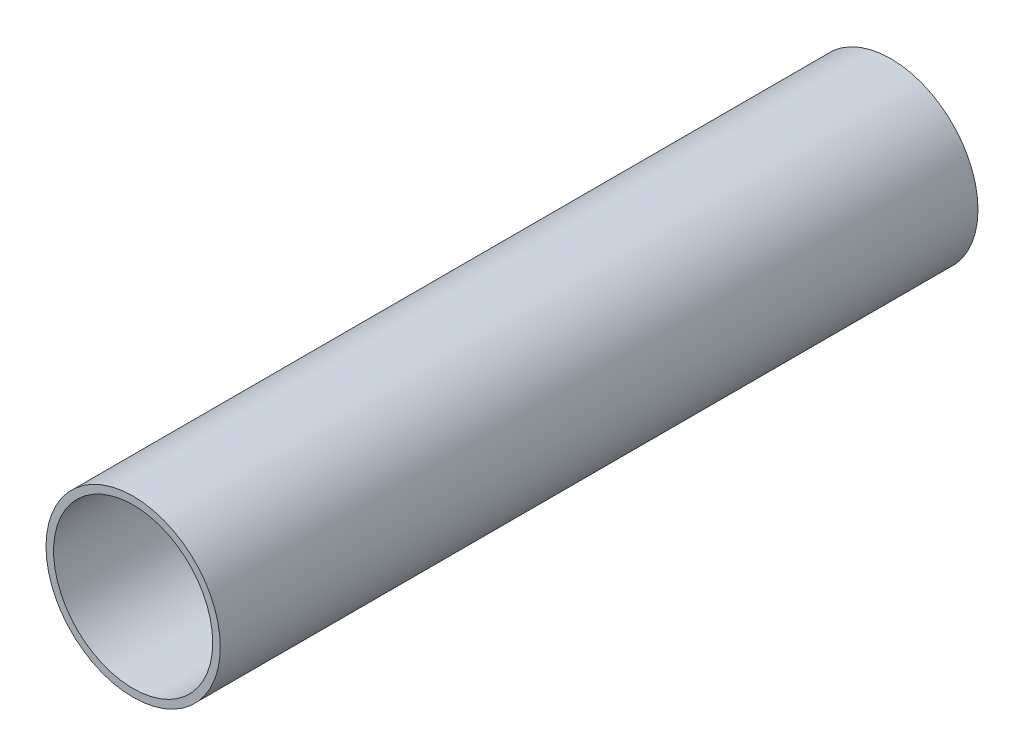
ISO-10303-21;
HEADER;
FILE_DESCRIPTION(('STEP AP214'),'2;1');
FILE_NAME('part.step','',(''),(''),'','','');
FILE_SCHEMA(('AUTOMOTIVE_DESIGN { 1 0 10303 214 1 1 1 1 }'));
ENDSEC;
DATA;
#1=APPLICATION_CONTEXT('core data for automotive mechanical design processes');
#2=APPLICATION_PROTOCOL_DEFINITION('international standard','automotive_design',2000,#1);
#3=PRODUCT_CONTEXT('',#1,'mechanical');
#4=PRODUCT('Part','Part','',(#3));
#5=PRODUCT_RELATED_PRODUCT_CATEGORY('part','',(#4));
#6=PRODUCT_DEFINITION_FORMATION('','',#4);
#7=PRODUCT_DEFINITION_CONTEXT('part definition',#1,'design');
#8=PRODUCT_DEFINITION('design','',#6,#7);
#9=PRODUCT_DEFINITION_SHAPE('','',#8);
#10=(LENGTH_UNIT() NAMED_UNIT(*) SI_UNIT(.MILLI.,.METRE.));
#11=(NAMED_UNIT(*) PLANE_ANGLE_UNIT() SI_UNIT($,.RADIAN.));
#12=(NAMED_UNIT(*) SI_UNIT($,.STERADIAN.) SOLID_ANGLE_UNIT());
#13=UNCERTAINTY_MEASURE_WITH_UNIT(LENGTH_MEASURE(1.E-05),#10,'distance_accuracy_value','');
#14=(GEOMETRIC_REPRESENTATION_CONTEXT(3) GLOBAL_UNCERTAINTY_ASSIGNED_CONTEXT((#13)) GLOBAL_UNIT_ASSIGNED_CONTEXT((#10,
#11,#12)) REPRESENTATION_CONTEXT('',''));
#15=CARTESIAN_POINT('',(0.,0.,0.));
#16=DIRECTION('',(0.,0.,1.));
#17=DIRECTION('',(1.,0.,0.));
#18=AXIS2_PLACEMENT_3D('',#15,#16,#17);
#19=CARTESIAN_POINT('',(0.,0.,100.));
#20=DIRECTION('',(0.,0.,1.));
#21=DIRECTION('',(1.,0.,0.));
#22=AXIS2_PLACEMENT_3D('',#19,#20,#21);
#23=PLANE('',#22);
#24=CARTESIAN_POINT('',(0.,0.,100.));
#25=DIRECTION('',(0.,0.,1.));
#26=DIRECTION('',(1.,0.,0.));
#27=AXIS2_PLACEMENT_3D('',#24,#25,#26);
#28=CIRCLE('',#27,11.5);
#29=CARTESIAN_POINT('',(11.5,0.,100.));
#30=VERTEX_POINT('',#29);
#31=EDGE_CURVE('E10',#30,#30,#28,.T.);
#32=ORIENTED_EDGE('',*,*,#31,.T.);
#33=EDGE_LOOP('',(#32));
#34=FACE_BOUND('',#33,.T.);
#35=CARTESIAN_POINT('',(0.,0.,100.));
#36=DIRECTION('',(0.,0.,1.));
#37=DIRECTION('',(1.,0.,0.));
#38=AXIS2_PLACEMENT_3D('',#35,#36,#37);
#39=CIRCLE('',#38,10.5);
#40=CARTESIAN_POINT('',(10.5,0.,100.));
#41=VERTEX_POINT('',#40);
#42=EDGE_CURVE('E42',#41,#41,#39,.T.);
#43=ORIENTED_EDGE('',*,*,#42,.F.);
#44=EDGE_LOOP('',(#43));
#45=FACE_BOUND('',#44,.T.);
#46=ADVANCED_FACE('F31',(#34,#45),#23,.T.);
#47=CARTESIAN_POINT('',(0.,0.,0.));
#48=DIRECTION('',(0.,0.,1.));
#49=DIRECTION('',(1.,0.,0.));
#50=AXIS2_PLACEMENT_3D('',#47,#48,#49);
#51=PLANE('',#50);
#52=CARTESIAN_POINT('',(0.,0.,0.));
#53=DIRECTION('',(0.,0.,1.));
#54=DIRECTION('',(1.,0.,0.));
#55=AXIS2_PLACEMENT_3D('',#52,#53,#54);
#56=CIRCLE('',#55,11.5);
#57=CARTESIAN_POINT('',(11.5,0.,0.));
#58=VERTEX_POINT('',#57);
#59=EDGE_CURVE('E35',#58,#58,#56,.T.);
#60=ORIENTED_EDGE('',*,*,#59,.F.);
#61=EDGE_LOOP('',(#60));
#62=FACE_BOUND('',#61,.T.);
#63=CARTESIAN_POINT('',(0.,0.,0.));
#64=DIRECTION('',(0.,0.,1.));
#65=DIRECTION('',(1.,0.,0.));
#66=AXIS2_PLACEMENT_3D('',#63,#64,#65);
#67=CIRCLE('',#66,10.5);
#68=CARTESIAN_POINT('',(10.5,0.,0.));
#69=VERTEX_POINT('',#68);
#70=EDGE_CURVE('E44',#69,#69,#67,.T.);
#71=ORIENTED_EDGE('',*,*,#70,.T.);
#72=EDGE_LOOP('',(#71));
#73=FACE_BOUND('',#72,.T.);
#74=ADVANCED_FACE('F54',(#62,#73),#51,.F.);
#75=CARTESIAN_POINT('',(0.,0.,100.));
#76=DIRECTION('',(0.,0.,-1.));
#77=DIRECTION('',(-1.,0.,0.));
#78=AXIS2_PLACEMENT_3D('',#75,#76,#77);
#79=CYLINDRICAL_SURFACE('',#78,11.5);
#80=ORIENTED_EDGE('',*,*,#31,.F.);
#81=EDGE_LOOP('',(#80));
#82=FACE_BOUND('',#81,.T.);
#83=ORIENTED_EDGE('',*,*,#59,.T.);
#84=EDGE_LOOP('',(#83));
#85=FACE_BOUND('',#84,.T.);
#86=ADVANCED_FACE('F33',(#82,#85),#79,.T.);
#87=CARTESIAN_POINT('',(0.,0.,100.));
#88=DIRECTION('',(0.,0.,-1.));
#89=DIRECTION('',(-1.,0.,0.));
#90=AXIS2_PLACEMENT_3D('',#87,#88,#89);
#91=CYLINDRICAL_SURFACE('',#90,10.5);
#92=ORIENTED_EDGE('',*,*,#42,.T.);
#93=EDGE_LOOP('',(#92));
#94=FACE_BOUND('',#93,.T.);
#95=ORIENTED_EDGE('',*,*,#70,.F.);
#96=EDGE_LOOP('',(#95));
#97=FACE_BOUND('',#96,.T.);
#98=ADVANCED_FACE('F50',(#94,#97),#91,.F.);
#99=CLOSED_SHELL('',(#46,#74,#86,#98));
#100=MANIFOLD_SOLID_BREP('B2',#99);
#101=ADVANCED_BREP_SHAPE_REPRESENTATION('',(#18,#100),#14);
#102=SHAPE_DEFINITION_REPRESENTATION(#9,#101);
ENDSEC;
END-ISO-10303-21;
